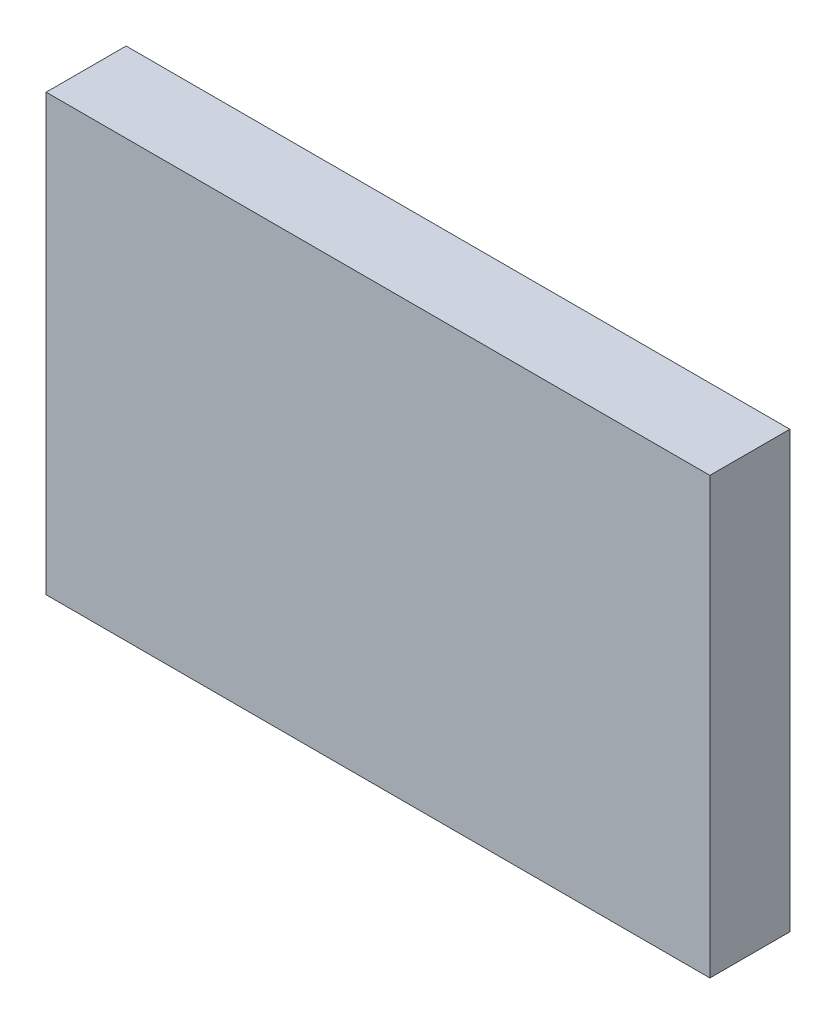
ISO-10303-21;
HEADER;
FILE_DESCRIPTION(('STEP AP214'),'2;1');
FILE_NAME('part.step','',(''),(''),'','','');
FILE_SCHEMA(('AUTOMOTIVE_DESIGN { 1 0 10303 214 1 1 1 1 }'));
ENDSEC;
DATA;
#1=APPLICATION_CONTEXT('core data for automotive mechanical design processes');
#2=APPLICATION_PROTOCOL_DEFINITION('international standard','automotive_design',2000,#1);
#3=PRODUCT_CONTEXT('',#1,'mechanical');
#4=PRODUCT('Part','Part','',(#3));
#5=PRODUCT_RELATED_PRODUCT_CATEGORY('part','',(#4));
#6=PRODUCT_DEFINITION_FORMATION('','',#4);
#7=PRODUCT_DEFINITION_CONTEXT('part definition',#1,'design');
#8=PRODUCT_DEFINITION('design','',#6,#7);
#9=PRODUCT_DEFINITION_SHAPE('','',#8);
#10=(LENGTH_UNIT() NAMED_UNIT(*) SI_UNIT(.MILLI.,.METRE.));
#11=(NAMED_UNIT(*) PLANE_ANGLE_UNIT() SI_UNIT($,.RADIAN.));
#12=(NAMED_UNIT(*) SI_UNIT($,.STERADIAN.) SOLID_ANGLE_UNIT());
#13=UNCERTAINTY_MEASURE_WITH_UNIT(LENGTH_MEASURE(1.E-05),#10,'distance_accuracy_value','');
#14=(GEOMETRIC_REPRESENTATION_CONTEXT(3) GLOBAL_UNCERTAINTY_ASSIGNED_CONTEXT((#13)) GLOBAL_UNIT_ASSIGNED_CONTEXT((#10,
#11,#12)) REPRESENTATION_CONTEXT('',''));
#15=CARTESIAN_POINT('',(0.,0.,0.));
#16=DIRECTION('',(0.,0.,1.));
#17=DIRECTION('',(1.,0.,0.));
#18=AXIS2_PLACEMENT_3D('',#15,#16,#17);
#19=CARTESIAN_POINT('',(-39.3659112090147,-22.7824324324324,6.3));
#20=DIRECTION('',(1.,0.,0.));
#21=DIRECTION('',(0.,0.,-1.));
#22=AXIS2_PLACEMENT_3D('',#19,#20,#21);
#23=PLANE('',#22);
#24=DIRECTION('',(0.,-1.,0.));
#25=VECTOR('',#24,1.);
#26=CARTESIAN_POINT('',(-39.3659112090147,-22.7824324324324,0.));
#27=LINE('',#26,#25);
#28=CARTESIAN_POINT('',(-39.3659112090147,11.5175675675676,0.));
#29=VERTEX_POINT('',#28);
#30=CARTESIAN_POINT('',(-39.3659112090147,-22.7824324324324,0.));
#31=VERTEX_POINT('',#30);
#32=EDGE_CURVE('E95',#29,#31,#27,.T.);
#33=ORIENTED_EDGE('',*,*,#32,.T.);
#34=DIRECTION('',(0.,0.,-1.));
#35=VECTOR('',#34,1.);
#36=CARTESIAN_POINT('',(-39.3659112090147,-22.7824324324324,6.3));
#37=LINE('',#36,#35);
#38=CARTESIAN_POINT('',(-39.3659112090147,-22.7824324324324,6.3));
#39=VERTEX_POINT('',#38);
#40=EDGE_CURVE('E11',#39,#31,#37,.T.);
#41=ORIENTED_EDGE('',*,*,#40,.F.);
#42=DIRECTION('',(0.,-1.,0.));
#43=VECTOR('',#42,1.);
#44=CARTESIAN_POINT('',(-39.3659112090147,-22.7824324324324,6.3));
#45=LINE('',#44,#43);
#46=CARTESIAN_POINT('',(-39.3659112090147,11.5175675675676,6.3));
#47=VERTEX_POINT('',#46);
#48=EDGE_CURVE('E83',#47,#39,#45,.T.);
#49=ORIENTED_EDGE('',*,*,#48,.F.);
#50=DIRECTION('',(0.,0.,-1.));
#51=VECTOR('',#50,1.);
#52=CARTESIAN_POINT('',(-39.3659112090147,11.5175675675676,6.3));
#53=LINE('',#52,#51);
#54=EDGE_CURVE('E91',#47,#29,#53,.T.);
#55=ORIENTED_EDGE('',*,*,#54,.T.);
#56=EDGE_LOOP('',(#33,#41,#49,#55));
#57=FACE_BOUND('',#56,.T.);
#58=ADVANCED_FACE('F32',(#57),#23,.F.);
#59=CARTESIAN_POINT('',(-39.3659112090147,-22.7824324324324,6.3));
#60=DIRECTION('',(0.,1.,0.));
#61=DIRECTION('',(0.,0.,1.));
#62=AXIS2_PLACEMENT_3D('',#59,#60,#61);
#63=PLANE('',#62);
#64=DIRECTION('',(1.,0.,0.));
#65=VECTOR('',#64,1.);
#66=CARTESIAN_POINT('',(-39.3659112090147,-22.7824324324324,0.));
#67=LINE('',#66,#65);
#68=CARTESIAN_POINT('',(12.9340887909853,-22.7824324324324,0.));
#69=VERTEX_POINT('',#68);
#70=EDGE_CURVE('E87',#31,#69,#67,.T.);
#71=ORIENTED_EDGE('',*,*,#70,.T.);
#72=DIRECTION('',(0.,0.,-1.));
#73=VECTOR('',#72,1.);
#74=CARTESIAN_POINT('',(12.9340887909853,-22.7824324324324,6.3));
#75=LINE('',#74,#73);
#76=CARTESIAN_POINT('',(12.9340887909853,-22.7824324324324,6.3));
#77=VERTEX_POINT('',#76);
#78=EDGE_CURVE('E40',#77,#69,#75,.T.);
#79=ORIENTED_EDGE('',*,*,#78,.F.);
#80=DIRECTION('',(1.,0.,0.));
#81=VECTOR('',#80,1.);
#82=CARTESIAN_POINT('',(-39.3659112090147,-22.7824324324324,6.3));
#83=LINE('',#82,#81);
#84=EDGE_CURVE('E78',#39,#77,#83,.T.);
#85=ORIENTED_EDGE('',*,*,#84,.F.);
#86=ORIENTED_EDGE('',*,*,#40,.T.);
#87=EDGE_LOOP('',(#71,#79,#85,#86));
#88=FACE_BOUND('',#87,.T.);
#89=ADVANCED_FACE('F86',(#88),#63,.F.);
#90=CARTESIAN_POINT('',(12.9340887909853,-22.7824324324324,6.3));
#91=DIRECTION('',(-1.,0.,0.));
#92=DIRECTION('',(0.,0.,1.));
#93=AXIS2_PLACEMENT_3D('',#90,#91,#92);
#94=PLANE('',#93);
#95=DIRECTION('',(0.,1.,0.));
#96=VECTOR('',#95,1.);
#97=CARTESIAN_POINT('',(12.9340887909853,-22.7824324324324,0.));
#98=LINE('',#97,#96);
#99=CARTESIAN_POINT('',(12.9340887909853,11.5175675675676,0.));
#100=VERTEX_POINT('',#99);
#101=EDGE_CURVE('E65',#69,#100,#98,.T.);
#102=ORIENTED_EDGE('',*,*,#101,.T.);
#103=DIRECTION('',(0.,0.,-1.));
#104=VECTOR('',#103,1.);
#105=CARTESIAN_POINT('',(12.9340887909853,11.5175675675676,6.3));
#106=LINE('',#105,#104);
#107=CARTESIAN_POINT('',(12.9340887909853,11.5175675675676,6.3));
#108=VERTEX_POINT('',#107);
#109=EDGE_CURVE('E88',#108,#100,#106,.T.);
#110=ORIENTED_EDGE('',*,*,#109,.F.);
#111=DIRECTION('',(0.,1.,0.));
#112=VECTOR('',#111,1.);
#113=CARTESIAN_POINT('',(12.9340887909853,-22.7824324324324,6.3));
#114=LINE('',#113,#112);
#115=EDGE_CURVE('E81',#77,#108,#114,.T.);
#116=ORIENTED_EDGE('',*,*,#115,.F.);
#117=ORIENTED_EDGE('',*,*,#78,.T.);
#118=EDGE_LOOP('',(#102,#110,#116,#117));
#119=FACE_BOUND('',#118,.T.);
#120=ADVANCED_FACE('F89',(#119),#94,.F.);
#121=CARTESIAN_POINT('',(-39.3659112090147,11.5175675675676,6.3));
#122=DIRECTION('',(0.,-1.,0.));
#123=DIRECTION('',(0.,0.,-1.));
#124=AXIS2_PLACEMENT_3D('',#121,#122,#123);
#125=PLANE('',#124);
#126=DIRECTION('',(-1.,0.,0.));
#127=VECTOR('',#126,1.);
#128=CARTESIAN_POINT('',(-39.3659112090147,11.5175675675676,0.));
#129=LINE('',#128,#127);
#130=EDGE_CURVE('E71',#100,#29,#129,.T.);
#131=ORIENTED_EDGE('',*,*,#130,.T.);
#132=ORIENTED_EDGE('',*,*,#54,.F.);
#133=DIRECTION('',(-1.,0.,0.));
#134=VECTOR('',#133,1.);
#135=CARTESIAN_POINT('',(-39.3659112090147,11.5175675675676,6.3));
#136=LINE('',#135,#134);
#137=EDGE_CURVE('E48',#108,#47,#136,.T.);
#138=ORIENTED_EDGE('',*,*,#137,.F.);
#139=ORIENTED_EDGE('',*,*,#109,.T.);
#140=EDGE_LOOP('',(#131,#132,#138,#139));
#141=FACE_BOUND('',#140,.T.);
#142=ADVANCED_FACE('F102',(#141),#125,.F.);
#143=CARTESIAN_POINT('',(0.,0.,6.3));
#144=DIRECTION('',(0.,0.,-1.));
#145=DIRECTION('',(-1.,0.,0.));
#146=AXIS2_PLACEMENT_3D('',#143,#144,#145);
#147=PLANE('',#146);
#148=ORIENTED_EDGE('',*,*,#48,.T.);
#149=ORIENTED_EDGE('',*,*,#84,.T.);
#150=ORIENTED_EDGE('',*,*,#115,.T.);
#151=ORIENTED_EDGE('',*,*,#137,.T.);
#152=EDGE_LOOP('',(#148,#149,#150,#151));
#153=FACE_BOUND('',#152,.T.);
#154=ADVANCED_FACE('F79',(#153),#147,.F.);
#155=CARTESIAN_POINT('',(0.,0.,0.));
#156=DIRECTION('',(0.,0.,-1.));
#157=DIRECTION('',(-1.,0.,0.));
#158=AXIS2_PLACEMENT_3D('',#155,#156,#157);
#159=PLANE('',#158);
#160=ORIENTED_EDGE('',*,*,#32,.F.);
#161=ORIENTED_EDGE('',*,*,#130,.F.);
#162=ORIENTED_EDGE('',*,*,#101,.F.);
#163=ORIENTED_EDGE('',*,*,#70,.F.);
#164=EDGE_LOOP('',(#160,#161,#162,#163));
#165=FACE_BOUND('',#164,.T.);
#166=ADVANCED_FACE('F105',(#165),#159,.T.);
#167=CLOSED_SHELL('',(#58,#89,#120,#142,#154,#166));
#168=MANIFOLD_SOLID_BREP('B2',#167);
#169=ADVANCED_BREP_SHAPE_REPRESENTATION('',(#18,#168),#14);
#170=SHAPE_DEFINITION_REPRESENTATION(#9,#169);
ENDSEC;
END-ISO-10303-21;
